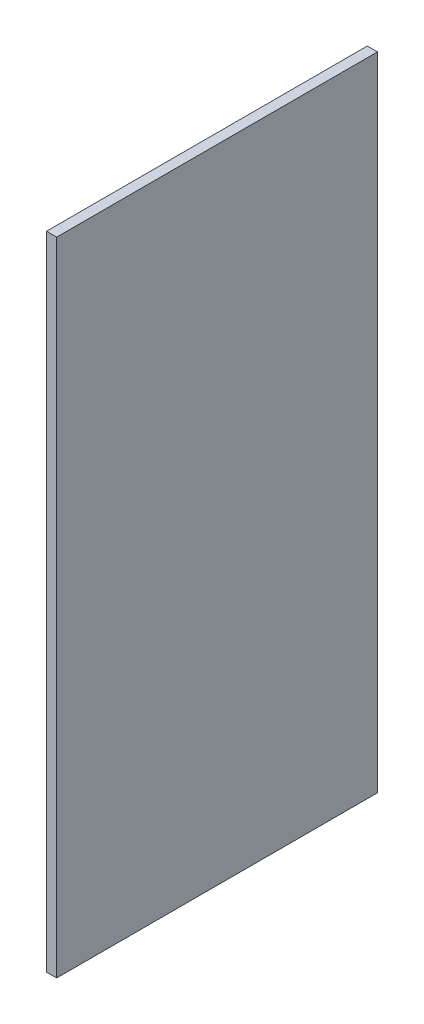
ISO-10303-21;
HEADER;
FILE_DESCRIPTION(('STEP AP214'),'2;1');
FILE_NAME('part.step','',(''),(''),'','','');
FILE_SCHEMA(('AUTOMOTIVE_DESIGN { 1 0 10303 214 1 1 1 1 }'));
ENDSEC;
DATA;
#1=APPLICATION_CONTEXT('core data for automotive mechanical design processes');
#2=APPLICATION_PROTOCOL_DEFINITION('international standard','automotive_design',2000,#1);
#3=PRODUCT_CONTEXT('',#1,'mechanical');
#4=PRODUCT('Part','Part','',(#3));
#5=PRODUCT_RELATED_PRODUCT_CATEGORY('part','',(#4));
#6=PRODUCT_DEFINITION_FORMATION('','',#4);
#7=PRODUCT_DEFINITION_CONTEXT('part definition',#1,'design');
#8=PRODUCT_DEFINITION('design','',#6,#7);
#9=PRODUCT_DEFINITION_SHAPE('','',#8);
#10=(LENGTH_UNIT() NAMED_UNIT(*) SI_UNIT(.MILLI.,.METRE.));
#11=(NAMED_UNIT(*) PLANE_ANGLE_UNIT() SI_UNIT($,.RADIAN.));
#12=(NAMED_UNIT(*) SI_UNIT($,.STERADIAN.) SOLID_ANGLE_UNIT());
#13=UNCERTAINTY_MEASURE_WITH_UNIT(LENGTH_MEASURE(1.E-05),#10,'distance_accuracy_value','');
#14=(GEOMETRIC_REPRESENTATION_CONTEXT(3) GLOBAL_UNCERTAINTY_ASSIGNED_CONTEXT((#13)) GLOBAL_UNIT_ASSIGNED_CONTEXT((#10,
#11,#12)) REPRESENTATION_CONTEXT('',''));
#15=CARTESIAN_POINT('',(0.,0.,0.));
#16=DIRECTION('',(0.,0.,1.));
#17=DIRECTION('',(1.,0.,0.));
#18=AXIS2_PLACEMENT_3D('',#15,#16,#17);
#19=CARTESIAN_POINT('',(3.175,0.,0.));
#20=DIRECTION('',(0.,0.,-1.));
#21=DIRECTION('',(0.,1.,0.));
#22=AXIS2_PLACEMENT_3D('',#19,#20,#21);
#23=PLANE('',#22);
#24=DIRECTION('',(0.,-1.,0.));
#25=VECTOR('',#24,1.);
#26=CARTESIAN_POINT('',(0.,0.,0.));
#27=LINE('',#26,#25);
#28=CARTESIAN_POINT('',(0.,0.,0.));
#29=VERTEX_POINT('',#28);
#30=CARTESIAN_POINT('',(0.,-200.,0.));
#31=VERTEX_POINT('',#30);
#32=EDGE_CURVE('E96',#29,#31,#27,.T.);
#33=ORIENTED_EDGE('',*,*,#32,.T.);
#34=DIRECTION('',(-1.,0.,0.));
#35=VECTOR('',#34,1.);
#36=CARTESIAN_POINT('',(3.175,-200.,0.));
#37=LINE('',#36,#35);
#38=CARTESIAN_POINT('',(3.175,-200.,0.));
#39=VERTEX_POINT('',#38);
#40=EDGE_CURVE('E11',#39,#31,#37,.T.);
#41=ORIENTED_EDGE('',*,*,#40,.F.);
#42=DIRECTION('',(0.,-1.,0.));
#43=VECTOR('',#42,1.);
#44=CARTESIAN_POINT('',(3.175,0.,0.));
#45=LINE('',#44,#43);
#46=CARTESIAN_POINT('',(3.175,0.,0.));
#47=VERTEX_POINT('',#46);
#48=EDGE_CURVE('E84',#47,#39,#45,.T.);
#49=ORIENTED_EDGE('',*,*,#48,.F.);
#50=DIRECTION('',(-1.,0.,0.));
#51=VECTOR('',#50,1.);
#52=CARTESIAN_POINT('',(3.175,0.,0.));
#53=LINE('',#52,#51);
#54=EDGE_CURVE('E92',#47,#29,#53,.T.);
#55=ORIENTED_EDGE('',*,*,#54,.T.);
#56=EDGE_LOOP('',(#33,#41,#49,#55));
#57=FACE_BOUND('',#56,.T.);
#58=ADVANCED_FACE('F33',(#57),#23,.F.);
#59=CARTESIAN_POINT('',(3.175,-200.,0.));
#60=DIRECTION('',(0.,1.,0.));
#61=DIRECTION('',(0.,0.,1.));
#62=AXIS2_PLACEMENT_3D('',#59,#60,#61);
#63=PLANE('',#62);
#64=DIRECTION('',(0.,0.,-1.));
#65=VECTOR('',#64,1.);
#66=CARTESIAN_POINT('',(0.,-200.,0.));
#67=LINE('',#66,#65);
#68=CARTESIAN_POINT('',(0.,-200.,-100.));
#69=VERTEX_POINT('',#68);
#70=EDGE_CURVE('E88',#31,#69,#67,.T.);
#71=ORIENTED_EDGE('',*,*,#70,.T.);
#72=DIRECTION('',(-1.,0.,0.));
#73=VECTOR('',#72,1.);
#74=CARTESIAN_POINT('',(3.175,-200.,-100.));
#75=LINE('',#74,#73);
#76=CARTESIAN_POINT('',(3.175,-200.,-100.));
#77=VERTEX_POINT('',#76);
#78=EDGE_CURVE('E41',#77,#69,#75,.T.);
#79=ORIENTED_EDGE('',*,*,#78,.F.);
#80=DIRECTION('',(0.,0.,-1.));
#81=VECTOR('',#80,1.);
#82=CARTESIAN_POINT('',(3.175,-200.,0.));
#83=LINE('',#82,#81);
#84=EDGE_CURVE('E79',#39,#77,#83,.T.);
#85=ORIENTED_EDGE('',*,*,#84,.F.);
#86=ORIENTED_EDGE('',*,*,#40,.T.);
#87=EDGE_LOOP('',(#71,#79,#85,#86));
#88=FACE_BOUND('',#87,.T.);
#89=ADVANCED_FACE('F87',(#88),#63,.F.);
#90=CARTESIAN_POINT('',(3.175,0.,-100.));
#91=DIRECTION('',(0.,0.,1.));
#92=DIRECTION('',(0.,-1.,0.));
#93=AXIS2_PLACEMENT_3D('',#90,#91,#92);
#94=PLANE('',#93);
#95=DIRECTION('',(0.,1.,0.));
#96=VECTOR('',#95,1.);
#97=CARTESIAN_POINT('',(0.,0.,-100.));
#98=LINE('',#97,#96);
#99=CARTESIAN_POINT('',(0.,0.,-100.));
#100=VERTEX_POINT('',#99);
#101=EDGE_CURVE('E66',#69,#100,#98,.T.);
#102=ORIENTED_EDGE('',*,*,#101,.T.);
#103=DIRECTION('',(-1.,0.,0.));
#104=VECTOR('',#103,1.);
#105=CARTESIAN_POINT('',(3.175,0.,-100.));
#106=LINE('',#105,#104);
#107=CARTESIAN_POINT('',(3.175,0.,-100.));
#108=VERTEX_POINT('',#107);
#109=EDGE_CURVE('E89',#108,#100,#106,.T.);
#110=ORIENTED_EDGE('',*,*,#109,.F.);
#111=DIRECTION('',(0.,1.,0.));
#112=VECTOR('',#111,1.);
#113=CARTESIAN_POINT('',(3.175,0.,-100.));
#114=LINE('',#113,#112);
#115=EDGE_CURVE('E82',#77,#108,#114,.T.);
#116=ORIENTED_EDGE('',*,*,#115,.F.);
#117=ORIENTED_EDGE('',*,*,#78,.T.);
#118=EDGE_LOOP('',(#102,#110,#116,#117));
#119=FACE_BOUND('',#118,.T.);
#120=ADVANCED_FACE('F90',(#119),#94,.F.);
#121=CARTESIAN_POINT('',(3.175,0.,0.));
#122=DIRECTION('',(0.,-1.,0.));
#123=DIRECTION('',(0.,0.,-1.));
#124=AXIS2_PLACEMENT_3D('',#121,#122,#123);
#125=PLANE('',#124);
#126=DIRECTION('',(0.,0.,1.));
#127=VECTOR('',#126,1.);
#128=CARTESIAN_POINT('',(0.,0.,0.));
#129=LINE('',#128,#127);
#130=EDGE_CURVE('E72',#100,#29,#129,.T.);
#131=ORIENTED_EDGE('',*,*,#130,.T.);
#132=ORIENTED_EDGE('',*,*,#54,.F.);
#133=DIRECTION('',(0.,0.,1.));
#134=VECTOR('',#133,1.);
#135=CARTESIAN_POINT('',(3.175,0.,0.));
#136=LINE('',#135,#134);
#137=EDGE_CURVE('E49',#108,#47,#136,.T.);
#138=ORIENTED_EDGE('',*,*,#137,.F.);
#139=ORIENTED_EDGE('',*,*,#109,.T.);
#140=EDGE_LOOP('',(#131,#132,#138,#139));
#141=FACE_BOUND('',#140,.T.);
#142=ADVANCED_FACE('F103',(#141),#125,.F.);
#143=CARTESIAN_POINT('',(3.175,0.,0.));
#144=DIRECTION('',(1.,0.,0.));
#145=DIRECTION('',(0.,0.,-1.));
#146=AXIS2_PLACEMENT_3D('',#143,#144,#145);
#147=PLANE('',#146);
#148=ORIENTED_EDGE('',*,*,#48,.T.);
#149=ORIENTED_EDGE('',*,*,#84,.T.);
#150=ORIENTED_EDGE('',*,*,#115,.T.);
#151=ORIENTED_EDGE('',*,*,#137,.T.);
#152=EDGE_LOOP('',(#148,#149,#150,#151));
#153=FACE_BOUND('',#152,.T.);
#154=ADVANCED_FACE('F80',(#153),#147,.T.);
#155=CARTESIAN_POINT('',(0.,0.,0.));
#156=DIRECTION('',(1.,0.,0.));
#157=DIRECTION('',(0.,0.,-1.));
#158=AXIS2_PLACEMENT_3D('',#155,#156,#157);
#159=PLANE('',#158);
#160=ORIENTED_EDGE('',*,*,#32,.F.);
#161=ORIENTED_EDGE('',*,*,#130,.F.);
#162=ORIENTED_EDGE('',*,*,#101,.F.);
#163=ORIENTED_EDGE('',*,*,#70,.F.);
#164=EDGE_LOOP('',(#160,#161,#162,#163));
#165=FACE_BOUND('',#164,.T.);
#166=ADVANCED_FACE('F106',(#165),#159,.F.);
#167=CLOSED_SHELL('',(#58,#89,#120,#142,#154,#166));
#168=MANIFOLD_SOLID_BREP('B2',#167);
#169=ADVANCED_BREP_SHAPE_REPRESENTATION('',(#18,#168),#14);
#170=SHAPE_DEFINITION_REPRESENTATION(#9,#169);
ENDSEC;
END-ISO-10303-21;
